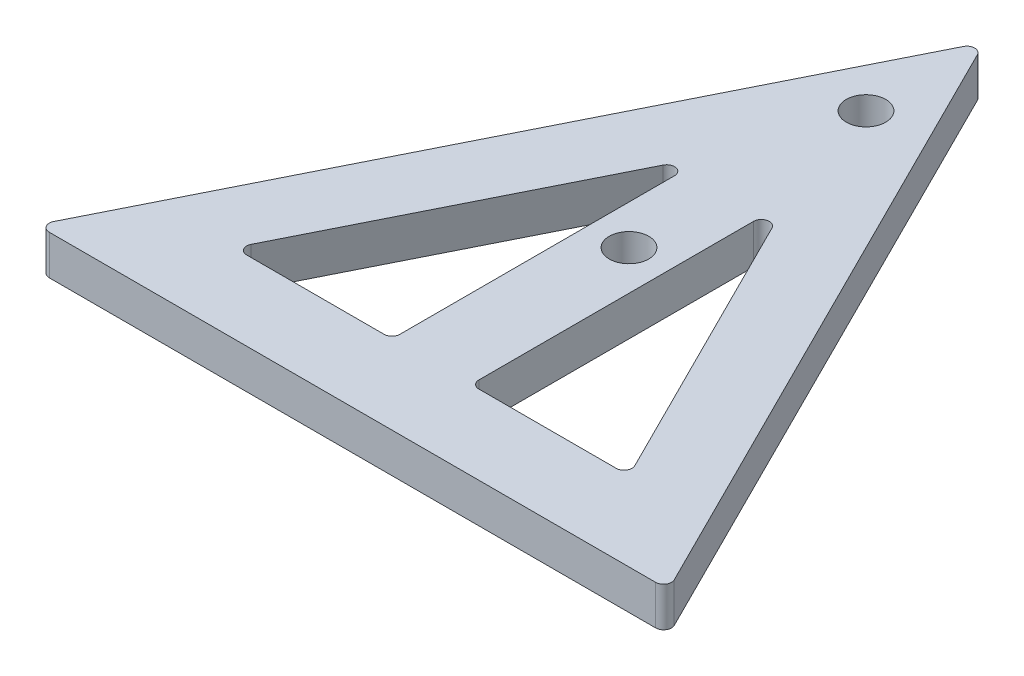
ISO-10303-21;
HEADER;
FILE_DESCRIPTION(('STEP AP214'),'2;1');
FILE_NAME('part.step','',(''),(''),'','','');
FILE_SCHEMA(('AUTOMOTIVE_DESIGN { 1 0 10303 214 1 1 1 1 }'));
ENDSEC;
DATA;
#1=APPLICATION_CONTEXT('core data for automotive mechanical design processes');
#2=APPLICATION_PROTOCOL_DEFINITION('international standard','automotive_design',2000,#1);
#3=PRODUCT_CONTEXT('',#1,'mechanical');
#4=PRODUCT('Part','Part','',(#3));
#5=PRODUCT_RELATED_PRODUCT_CATEGORY('part','',(#4));
#6=PRODUCT_DEFINITION_FORMATION('','',#4);
#7=PRODUCT_DEFINITION_CONTEXT('part definition',#1,'design');
#8=PRODUCT_DEFINITION('design','',#6,#7);
#9=PRODUCT_DEFINITION_SHAPE('','',#8);
#10=(LENGTH_UNIT() NAMED_UNIT(*) SI_UNIT(.MILLI.,.METRE.));
#11=(NAMED_UNIT(*) PLANE_ANGLE_UNIT() SI_UNIT($,.RADIAN.));
#12=(NAMED_UNIT(*) SI_UNIT($,.STERADIAN.) SOLID_ANGLE_UNIT());
#13=UNCERTAINTY_MEASURE_WITH_UNIT(LENGTH_MEASURE(1.E-05),#10,'distance_accuracy_value','');
#14=(GEOMETRIC_REPRESENTATION_CONTEXT(3) GLOBAL_UNCERTAINTY_ASSIGNED_CONTEXT((#13)) GLOBAL_UNIT_ASSIGNED_CONTEXT((#10,
#11,#12)) REPRESENTATION_CONTEXT('',''));
#15=CARTESIAN_POINT('',(0.,0.,0.));
#16=DIRECTION('',(0.,0.,1.));
#17=DIRECTION('',(1.,0.,0.));
#18=AXIS2_PLACEMENT_3D('',#15,#16,#17);
#19=CARTESIAN_POINT('',(0.,12.7,0.));
#20=DIRECTION('',(0.89442539322645,0.,0.447217191028823));
#21=DIRECTION('',(0.447217191028823,0.,-0.89442539322645));
#22=AXIS2_PLACEMENT_3D('',#19,#20,#21);
#23=PLANE('',#22);
#24=DIRECTION('',(-0.447217191028823,0.,0.89442539322645));
#25=VECTOR('',#24,1.);
#26=CARTESIAN_POINT('',(0.,0.,0.));
#27=LINE('',#26,#25);
#28=CARTESIAN_POINT('',(99.3281595012048,0.,-198.654322558452));
#29=VERTEX_POINT('',#28);
#30=CARTESIAN_POINT('',(1.8379843038673,0.,-3.67593166521321));
#31=VERTEX_POINT('',#30);
#32=EDGE_CURVE('E197',#29,#31,#27,.T.);
#33=ORIENTED_EDGE('',*,*,#32,.T.);
#34=DIRECTION('',(0.,-1.,0.));
#35=VECTOR('',#34,1.);
#36=CARTESIAN_POINT('',(1.8379843038673,12.7,-3.67593166521321));
#37=LINE('',#36,#35);
#38=CARTESIAN_POINT('',(1.8379843038673,12.7,-3.67593166521321));
#39=VERTEX_POINT('',#38);
#40=EDGE_CURVE('E175',#31,#39,#37,.F.);
#41=ORIENTED_EDGE('',*,*,#40,.T.);
#42=DIRECTION('',(-0.447217191028823,0.,0.89442539322645));
#43=VECTOR('',#42,1.);
#44=CARTESIAN_POINT('',(0.,12.7,0.));
#45=LINE('',#44,#43);
#46=CARTESIAN_POINT('',(99.3281595012048,12.7,-198.654322558452));
#47=VERTEX_POINT('',#46);
#48=EDGE_CURVE('E200',#47,#39,#45,.T.);
#49=ORIENTED_EDGE('',*,*,#48,.F.);
#50=DIRECTION('',(0.,-1.,0.));
#51=VECTOR('',#50,1.);
#52=CARTESIAN_POINT('',(99.3281595012048,12.7,-198.654322558452));
#53=LINE('',#52,#51);
#54=EDGE_CURVE('E180',#47,#29,#53,.T.);
#55=ORIENTED_EDGE('',*,*,#54,.T.);
#56=EDGE_LOOP('',(#33,#41,#49,#55));
#57=FACE_BOUND('',#56,.T.);
#58=ADVANCED_FACE('F44',(#57),#23,.F.);
#59=CARTESIAN_POINT('',(0.,12.7,0.));
#60=DIRECTION('',(0.,0.,-1.));
#61=DIRECTION('',(-1.,0.,0.));
#62=AXIS2_PLACEMENT_3D('',#59,#60,#61);
#63=PLANE('',#62);
#64=DIRECTION('',(1.,0.,0.));
#65=VECTOR('',#64,1.);
#66=CARTESIAN_POINT('',(0.,12.7,0.));
#67=LINE('',#66,#65);
#68=CARTESIAN_POINT('',(4.10982480266249,12.7,0.));
#69=VERTEX_POINT('',#68);
#70=CARTESIAN_POINT('',(199.090175197338,12.7,0.));
#71=VERTEX_POINT('',#70);
#72=EDGE_CURVE('E190',#69,#71,#67,.T.);
#73=ORIENTED_EDGE('',*,*,#72,.F.);
#74=DIRECTION('',(0.,-1.,0.));
#75=VECTOR('',#74,1.);
#76=CARTESIAN_POINT('',(4.10982480266249,12.7,0.));
#77=LINE('',#76,#75);
#78=CARTESIAN_POINT('',(4.10982480266249,0.,0.));
#79=VERTEX_POINT('',#78);
#80=EDGE_CURVE('E174',#69,#79,#77,.T.);
#81=ORIENTED_EDGE('',*,*,#80,.T.);
#82=DIRECTION('',(1.,0.,0.));
#83=VECTOR('',#82,1.);
#84=CARTESIAN_POINT('',(0.,0.,0.));
#85=LINE('',#84,#83);
#86=CARTESIAN_POINT('',(199.090175197338,0.,0.));
#87=VERTEX_POINT('',#86);
#88=EDGE_CURVE('E187',#79,#87,#85,.T.);
#89=ORIENTED_EDGE('',*,*,#88,.T.);
#90=DIRECTION('',(0.,-1.,0.));
#91=VECTOR('',#90,1.);
#92=CARTESIAN_POINT('',(199.090175197338,12.7,0.));
#93=LINE('',#92,#91);
#94=EDGE_CURVE('E192',#87,#71,#93,.F.);
#95=ORIENTED_EDGE('',*,*,#94,.T.);
#96=EDGE_LOOP('',(#73,#81,#89,#95));
#97=FACE_BOUND('',#96,.T.);
#98=ADVANCED_FACE('F186',(#97),#63,.F.);
#99=CARTESIAN_POINT('',(101.6,12.7,-203.197957893239));
#100=DIRECTION('',(-0.89442539322645,0.,0.447217191028823));
#101=DIRECTION('',(0.447217191028823,0.,0.89442539322645));
#102=AXIS2_PLACEMENT_3D('',#99,#100,#101);
#103=PLANE('',#102);
#104=DIRECTION('',(-0.447217191028823,0.,-0.89442539322645));
#105=VECTOR('',#104,1.);
#106=CARTESIAN_POINT('',(101.6,12.7,-203.197957893239));
#107=LINE('',#106,#105);
#108=CARTESIAN_POINT('',(201.362015696133,12.7,-3.67593166521318));
#109=VERTEX_POINT('',#108);
#110=CARTESIAN_POINT('',(103.871840498795,12.7,-198.654322558452));
#111=VERTEX_POINT('',#110);
#112=EDGE_CURVE('E206',#109,#111,#107,.T.);
#113=ORIENTED_EDGE('',*,*,#112,.F.);
#114=DIRECTION('',(0.,-1.,0.));
#115=VECTOR('',#114,1.);
#116=CARTESIAN_POINT('',(201.362015696133,12.7,-3.67593166521321));
#117=LINE('',#116,#115);
#118=CARTESIAN_POINT('',(201.362015696133,0.,-3.67593166521318));
#119=VERTEX_POINT('',#118);
#120=EDGE_CURVE('E221',#109,#119,#117,.T.);
#121=ORIENTED_EDGE('',*,*,#120,.T.);
#122=DIRECTION('',(-0.447217191028823,0.,-0.89442539322645));
#123=VECTOR('',#122,1.);
#124=CARTESIAN_POINT('',(101.6,0.,-203.197957893239));
#125=LINE('',#124,#123);
#126=CARTESIAN_POINT('',(103.871840498795,0.,-198.654322558452));
#127=VERTEX_POINT('',#126);
#128=EDGE_CURVE('E196',#119,#127,#125,.T.);
#129=ORIENTED_EDGE('',*,*,#128,.T.);
#130=DIRECTION('',(0.,-1.,0.));
#131=VECTOR('',#130,1.);
#132=CARTESIAN_POINT('',(103.871840498795,12.7,-198.654322558452));
#133=LINE('',#132,#131);
#134=EDGE_CURVE('E219',#127,#111,#133,.F.);
#135=ORIENTED_EDGE('',*,*,#134,.T.);
#136=EDGE_LOOP('',(#113,#121,#129,#135));
#137=FACE_BOUND('',#136,.T.);
#138=ADVANCED_FACE('F343',(#137),#103,.F.);
#139=CARTESIAN_POINT('',(0.,12.7,0.));
#140=DIRECTION('',(0.,-1.,0.));
#141=DIRECTION('',(0.,0.,-1.));
#142=AXIS2_PLACEMENT_3D('',#139,#140,#141);
#143=PLANE('',#142);
#144=CARTESIAN_POINT('',(101.6,12.7,-88.9));
#145=DIRECTION('',(0.,1.,0.));
#146=DIRECTION('',(0.,0.,1.));
#147=AXIS2_PLACEMENT_3D('',#144,#145,#146);
#148=CIRCLE('',#147,6.34999999999999);
#149=CARTESIAN_POINT('',(101.6,12.7,-82.55));
#150=VERTEX_POINT('',#149);
#151=EDGE_CURVE('E406',#150,#150,#148,.T.);
#152=ORIENTED_EDGE('',*,*,#151,.F.);
#153=EDGE_LOOP('',(#152));
#154=FACE_BOUND('',#153,.T.);
#155=DIRECTION('',(1.,0.,0.));
#156=VECTOR('',#155,1.);
#157=CARTESIAN_POINT('',(38.1,12.7,-25.4));
#158=LINE('',#157,#156);
#159=CARTESIAN_POINT('',(42.2098063314247,12.7,-25.4));
#160=VERTEX_POINT('',#159);
#161=CARTESIAN_POINT('',(86.36,12.7,-25.4));
#162=VERTEX_POINT('',#161);
#163=EDGE_CURVE('E291',#160,#162,#158,.T.);
#164=ORIENTED_EDGE('',*,*,#163,.F.);
#165=CARTESIAN_POINT('',(42.2098063314247,12.7,-27.94));
#166=DIRECTION('',(0.,-1.,0.));
#167=DIRECTION('',(0.,0.,-1.));
#168=AXIS2_PLACEMENT_3D('',#165,#166,#167);
#169=CIRCLE('',#168,2.54);
#170=CARTESIAN_POINT('',(39.937961266285,12.7,-29.0759225325699));
#171=VERTEX_POINT('',#170);
#172=EDGE_CURVE('E13',#160,#171,#169,.T.);
#173=ORIENTED_EDGE('',*,*,#172,.T.);
#174=DIRECTION('',(0.447213595499958,0.,-0.894427190999916));
#175=VECTOR('',#174,1.);
#176=CARTESIAN_POINT('',(38.1,12.7,-25.4));
#177=LINE('',#176,#175);
#178=CARTESIAN_POINT('',(84.0881549348602,12.7,-117.37630986972));
#179=VERTEX_POINT('',#178);
#180=EDGE_CURVE('E202',#171,#179,#177,.T.);
#181=ORIENTED_EDGE('',*,*,#180,.T.);
#182=CARTESIAN_POINT('',(86.36,12.7,-116.240387337151));
#183=DIRECTION('',(0.,-1.,0.));
#184=DIRECTION('',(0.,0.,-1.));
#185=AXIS2_PLACEMENT_3D('',#182,#183,#184);
#186=CIRCLE('',#185,2.54);
#187=CARTESIAN_POINT('',(88.9,12.7,-116.240387337151));
#188=VERTEX_POINT('',#187);
#189=EDGE_CURVE('E267',#179,#188,#186,.T.);
#190=ORIENTED_EDGE('',*,*,#189,.T.);
#191=DIRECTION('',(0.,0.,-1.));
#192=VECTOR('',#191,1.);
#193=CARTESIAN_POINT('',(88.9,12.7,-25.4));
#194=LINE('',#193,#192);
#195=CARTESIAN_POINT('',(88.9,12.7,-27.94));
#196=VERTEX_POINT('',#195);
#197=EDGE_CURVE('E295',#196,#188,#194,.T.);
#198=ORIENTED_EDGE('',*,*,#197,.F.);
#199=CARTESIAN_POINT('',(86.36,12.7,-27.94));
#200=DIRECTION('',(0.,-1.,0.));
#201=DIRECTION('',(0.,0.,-1.));
#202=AXIS2_PLACEMENT_3D('',#199,#200,#201);
#203=CIRCLE('',#202,2.54);
#204=EDGE_CURVE('E59',#196,#162,#203,.T.);
#205=ORIENTED_EDGE('',*,*,#204,.T.);
#206=EDGE_LOOP('',(#164,#173,#181,#190,#198,#205));
#207=FACE_BOUND('',#206,.T.);
#208=DIRECTION('',(-0.447213595499958,0.,-0.894427190999916));
#209=VECTOR('',#208,1.);
#210=CARTESIAN_POINT('',(165.1,12.7,-25.4000000000001));
#211=LINE('',#210,#209);
#212=CARTESIAN_POINT('',(163.262038733715,12.7,-29.07592253257));
#213=VERTEX_POINT('',#212);
#214=CARTESIAN_POINT('',(119.11184506514,12.7,-117.37630986972));
#215=VERTEX_POINT('',#214);
#216=EDGE_CURVE('E308',#213,#215,#211,.T.);
#217=ORIENTED_EDGE('',*,*,#216,.F.);
#218=CARTESIAN_POINT('',(160.990193668575,12.7,-27.9400000000001));
#219=DIRECTION('',(0.,-1.,0.));
#220=DIRECTION('',(0.,0.,-1.));
#221=AXIS2_PLACEMENT_3D('',#218,#219,#220);
#222=CIRCLE('',#221,2.54);
#223=CARTESIAN_POINT('',(160.990193668575,12.7,-25.4000000000001));
#224=VERTEX_POINT('',#223);
#225=EDGE_CURVE('E255',#213,#224,#222,.T.);
#226=ORIENTED_EDGE('',*,*,#225,.T.);
#227=DIRECTION('',(-1.,0.,0.));
#228=VECTOR('',#227,1.);
#229=CARTESIAN_POINT('',(165.1,12.7,-25.4000000000001));
#230=LINE('',#229,#228);
#231=CARTESIAN_POINT('',(116.84,12.7,-25.4000000000001));
#232=VERTEX_POINT('',#231);
#233=EDGE_CURVE('E313',#224,#232,#230,.T.);
#234=ORIENTED_EDGE('',*,*,#233,.T.);
#235=CARTESIAN_POINT('',(116.84,12.7,-27.9400000000001));
#236=DIRECTION('',(0.,-1.,0.));
#237=DIRECTION('',(0.,0.,-1.));
#238=AXIS2_PLACEMENT_3D('',#235,#236,#237);
#239=CIRCLE('',#238,2.54);
#240=CARTESIAN_POINT('',(114.3,12.7,-27.9400000000001));
#241=VERTEX_POINT('',#240);
#242=EDGE_CURVE('E259',#232,#241,#239,.T.);
#243=ORIENTED_EDGE('',*,*,#242,.T.);
#244=DIRECTION('',(0.,0.,-1.));
#245=VECTOR('',#244,1.);
#246=CARTESIAN_POINT('',(114.3,12.7,-25.4000000000001));
#247=LINE('',#246,#245);
#248=CARTESIAN_POINT('',(114.3,12.7,-116.240387337151));
#249=VERTEX_POINT('',#248);
#250=EDGE_CURVE('E316',#241,#249,#247,.T.);
#251=ORIENTED_EDGE('',*,*,#250,.T.);
#252=CARTESIAN_POINT('',(116.84,12.7,-116.240387337151));
#253=DIRECTION('',(0.,-1.,0.));
#254=DIRECTION('',(0.,0.,-1.));
#255=AXIS2_PLACEMENT_3D('',#252,#253,#254);
#256=CIRCLE('',#255,2.54);
#257=EDGE_CURVE('E263',#249,#215,#256,.T.);
#258=ORIENTED_EDGE('',*,*,#257,.T.);
#259=EDGE_LOOP('',(#217,#226,#234,#243,#251,#258));
#260=FACE_BOUND('',#259,.T.);
#261=CARTESIAN_POINT('',(101.6,12.7,-165.097957893239));
#262=DIRECTION('',(0.,1.,0.));
#263=DIRECTION('',(0.,0.,1.));
#264=AXIS2_PLACEMENT_3D('',#261,#262,#263);
#265=CIRCLE('',#264,6.34999999999999);
#266=CARTESIAN_POINT('',(101.6,12.7,-158.747957893239));
#267=VERTEX_POINT('',#266);
#268=EDGE_CURVE('E324',#267,#267,#265,.T.);
#269=ORIENTED_EDGE('',*,*,#268,.F.);
#270=EDGE_LOOP('',(#269));
#271=FACE_BOUND('',#270,.T.);
#272=ORIENTED_EDGE('',*,*,#48,.T.);
#273=CARTESIAN_POINT('',(4.10982480266249,12.7,-2.54));
#274=DIRECTION('',(0.,-1.,0.));
#275=DIRECTION('',(0.,0.,-1.));
#276=AXIS2_PLACEMENT_3D('',#273,#274,#275);
#277=CIRCLE('',#276,2.54);
#278=EDGE_CURVE('E217',#39,#69,#277,.F.);
#279=ORIENTED_EDGE('',*,*,#278,.T.);
#280=ORIENTED_EDGE('',*,*,#72,.T.);
#281=CARTESIAN_POINT('',(199.090175197338,12.7,-2.53999999999999));
#282=DIRECTION('',(0.,-1.,0.));
#283=DIRECTION('',(0.,0.,-1.));
#284=AXIS2_PLACEMENT_3D('',#281,#282,#283);
#285=CIRCLE('',#284,2.54);
#286=EDGE_CURVE('E215',#71,#109,#285,.F.);
#287=ORIENTED_EDGE('',*,*,#286,.T.);
#288=ORIENTED_EDGE('',*,*,#112,.T.);
#289=CARTESIAN_POINT('',(101.6,12.7,-197.518390893239));
#290=DIRECTION('',(0.,-1.,0.));
#291=DIRECTION('',(0.,0.,-1.));
#292=AXIS2_PLACEMENT_3D('',#289,#290,#291);
#293=CIRCLE('',#292,2.54);
#294=EDGE_CURVE('E213',#111,#47,#293,.F.);
#295=ORIENTED_EDGE('',*,*,#294,.T.);
#296=EDGE_LOOP('',(#272,#279,#280,#287,#288,#295));
#297=FACE_BOUND('',#296,.T.);
#298=ADVANCED_FACE('F288',(#154,#207,#260,#271,#297),#143,.F.);
#299=CARTESIAN_POINT('',(0.,0.,0.));
#300=DIRECTION('',(0.,-1.,0.));
#301=DIRECTION('',(0.,0.,-1.));
#302=AXIS2_PLACEMENT_3D('',#299,#300,#301);
#303=PLANE('',#302);
#304=CARTESIAN_POINT('',(101.6,0.,-88.9));
#305=DIRECTION('',(0.,1.,0.));
#306=DIRECTION('',(0.,0.,1.));
#307=AXIS2_PLACEMENT_3D('',#304,#305,#306);
#308=CIRCLE('',#307,6.34999999999999);
#309=CARTESIAN_POINT('',(101.6,0.,-82.55));
#310=VERTEX_POINT('',#309);
#311=EDGE_CURVE('E327',#310,#310,#308,.T.);
#312=ORIENTED_EDGE('',*,*,#311,.T.);
#313=EDGE_LOOP('',(#312));
#314=FACE_BOUND('',#313,.T.);
#315=DIRECTION('',(0.447213595499958,0.,-0.894427190999916));
#316=VECTOR('',#315,1.);
#317=CARTESIAN_POINT('',(38.1,0.,-25.4));
#318=LINE('',#317,#316);
#319=CARTESIAN_POINT('',(39.937961266285,0.,-29.0759225325699));
#320=VERTEX_POINT('',#319);
#321=CARTESIAN_POINT('',(84.0881549348602,0.,-117.37630986972));
#322=VERTEX_POINT('',#321);
#323=EDGE_CURVE('E277',#320,#322,#318,.T.);
#324=ORIENTED_EDGE('',*,*,#323,.F.);
#325=CARTESIAN_POINT('',(42.2098063314247,0.,-27.94));
#326=DIRECTION('',(0.,-1.,0.));
#327=DIRECTION('',(0.,0.,-1.));
#328=AXIS2_PLACEMENT_3D('',#325,#326,#327);
#329=CIRCLE('',#328,2.54);
#330=CARTESIAN_POINT('',(42.2098063314247,0.,-25.4));
#331=VERTEX_POINT('',#330);
#332=EDGE_CURVE('E52',#320,#331,#329,.F.);
#333=ORIENTED_EDGE('',*,*,#332,.T.);
#334=DIRECTION('',(1.,0.,0.));
#335=VECTOR('',#334,1.);
#336=CARTESIAN_POINT('',(38.1,0.,-25.4));
#337=LINE('',#336,#335);
#338=CARTESIAN_POINT('',(86.36,0.,-25.4));
#339=VERTEX_POINT('',#338);
#340=EDGE_CURVE('E275',#331,#339,#337,.T.);
#341=ORIENTED_EDGE('',*,*,#340,.T.);
#342=CARTESIAN_POINT('',(86.36,0.,-27.94));
#343=DIRECTION('',(0.,-1.,0.));
#344=DIRECTION('',(0.,0.,-1.));
#345=AXIS2_PLACEMENT_3D('',#342,#343,#344);
#346=CIRCLE('',#345,2.54);
#347=CARTESIAN_POINT('',(88.9,0.,-27.94));
#348=VERTEX_POINT('',#347);
#349=EDGE_CURVE('E269',#339,#348,#346,.F.);
#350=ORIENTED_EDGE('',*,*,#349,.T.);
#351=DIRECTION('',(0.,0.,-1.));
#352=VECTOR('',#351,1.);
#353=CARTESIAN_POINT('',(88.9,0.,-25.4));
#354=LINE('',#353,#352);
#355=CARTESIAN_POINT('',(88.9,0.,-116.240387337151));
#356=VERTEX_POINT('',#355);
#357=EDGE_CURVE('E282',#348,#356,#354,.T.);
#358=ORIENTED_EDGE('',*,*,#357,.T.);
#359=CARTESIAN_POINT('',(86.36,0.,-116.240387337151));
#360=DIRECTION('',(0.,-1.,0.));
#361=DIRECTION('',(0.,0.,-1.));
#362=AXIS2_PLACEMENT_3D('',#359,#360,#361);
#363=CIRCLE('',#362,2.54);
#364=EDGE_CURVE('E265',#356,#322,#363,.F.);
#365=ORIENTED_EDGE('',*,*,#364,.T.);
#366=EDGE_LOOP('',(#324,#333,#341,#350,#358,#365));
#367=FACE_BOUND('',#366,.T.);
#368=DIRECTION('',(-1.,0.,0.));
#369=VECTOR('',#368,1.);
#370=CARTESIAN_POINT('',(165.1,0.,-25.4000000000001));
#371=LINE('',#370,#369);
#372=CARTESIAN_POINT('',(160.990193668575,0.,-25.4000000000001));
#373=VERTEX_POINT('',#372);
#374=CARTESIAN_POINT('',(116.84,0.,-25.4000000000001));
#375=VERTEX_POINT('',#374);
#376=EDGE_CURVE('E304',#373,#375,#371,.T.);
#377=ORIENTED_EDGE('',*,*,#376,.F.);
#378=CARTESIAN_POINT('',(160.990193668575,0.,-27.9400000000001));
#379=DIRECTION('',(0.,-1.,0.));
#380=DIRECTION('',(0.,0.,-1.));
#381=AXIS2_PLACEMENT_3D('',#378,#379,#380);
#382=CIRCLE('',#381,2.54);
#383=CARTESIAN_POINT('',(163.262038733715,0.,-29.07592253257));
#384=VERTEX_POINT('',#383);
#385=EDGE_CURVE('E253',#373,#384,#382,.F.);
#386=ORIENTED_EDGE('',*,*,#385,.T.);
#387=DIRECTION('',(-0.447213595499958,0.,-0.894427190999916));
#388=VECTOR('',#387,1.);
#389=CARTESIAN_POINT('',(165.1,0.,-25.4000000000001));
#390=LINE('',#389,#388);
#391=CARTESIAN_POINT('',(119.11184506514,0.,-117.37630986972));
#392=VERTEX_POINT('',#391);
#393=EDGE_CURVE('E283',#384,#392,#390,.T.);
#394=ORIENTED_EDGE('',*,*,#393,.T.);
#395=CARTESIAN_POINT('',(116.84,0.,-116.240387337151));
#396=DIRECTION('',(0.,-1.,0.));
#397=DIRECTION('',(0.,0.,-1.));
#398=AXIS2_PLACEMENT_3D('',#395,#396,#397);
#399=CIRCLE('',#398,2.54);
#400=CARTESIAN_POINT('',(114.3,0.,-116.240387337151));
#401=VERTEX_POINT('',#400);
#402=EDGE_CURVE('E261',#392,#401,#399,.F.);
#403=ORIENTED_EDGE('',*,*,#402,.T.);
#404=DIRECTION('',(0.,0.,-1.));
#405=VECTOR('',#404,1.);
#406=CARTESIAN_POINT('',(114.3,0.,-25.4000000000001));
#407=LINE('',#406,#405);
#408=CARTESIAN_POINT('',(114.3,0.,-27.9400000000001));
#409=VERTEX_POINT('',#408);
#410=EDGE_CURVE('E307',#409,#401,#407,.T.);
#411=ORIENTED_EDGE('',*,*,#410,.F.);
#412=CARTESIAN_POINT('',(116.84,0.,-27.9400000000001));
#413=DIRECTION('',(0.,-1.,0.));
#414=DIRECTION('',(0.,0.,-1.));
#415=AXIS2_PLACEMENT_3D('',#412,#413,#414);
#416=CIRCLE('',#415,2.54);
#417=EDGE_CURVE('E257',#409,#375,#416,.F.);
#418=ORIENTED_EDGE('',*,*,#417,.T.);
#419=EDGE_LOOP('',(#377,#386,#394,#403,#411,#418));
#420=FACE_BOUND('',#419,.T.);
#421=CARTESIAN_POINT('',(101.6,0.,-165.097957893239));
#422=DIRECTION('',(0.,1.,0.));
#423=DIRECTION('',(0.,0.,1.));
#424=AXIS2_PLACEMENT_3D('',#421,#422,#423);
#425=CIRCLE('',#424,6.34999999999999);
#426=CARTESIAN_POINT('',(101.6,0.,-158.747957893239));
#427=VERTEX_POINT('',#426);
#428=EDGE_CURVE('E317',#427,#427,#425,.T.);
#429=ORIENTED_EDGE('',*,*,#428,.T.);
#430=EDGE_LOOP('',(#429));
#431=FACE_BOUND('',#430,.T.);
#432=ORIENTED_EDGE('',*,*,#88,.F.);
#433=CARTESIAN_POINT('',(4.10982480266249,0.,-2.54));
#434=DIRECTION('',(0.,-1.,0.));
#435=DIRECTION('',(0.,0.,-1.));
#436=AXIS2_PLACEMENT_3D('',#433,#434,#435);
#437=CIRCLE('',#436,2.54);
#438=EDGE_CURVE('E170',#79,#31,#437,.T.);
#439=ORIENTED_EDGE('',*,*,#438,.T.);
#440=ORIENTED_EDGE('',*,*,#32,.F.);
#441=CARTESIAN_POINT('',(101.6,0.,-197.518390893239));
#442=DIRECTION('',(0.,-1.,0.));
#443=DIRECTION('',(0.,0.,-1.));
#444=AXIS2_PLACEMENT_3D('',#441,#442,#443);
#445=CIRCLE('',#444,2.54);
#446=EDGE_CURVE('E191',#29,#127,#445,.T.);
#447=ORIENTED_EDGE('',*,*,#446,.T.);
#448=ORIENTED_EDGE('',*,*,#128,.F.);
#449=CARTESIAN_POINT('',(199.090175197338,0.,-2.53999999999999));
#450=DIRECTION('',(0.,-1.,0.));
#451=DIRECTION('',(0.,0.,-1.));
#452=AXIS2_PLACEMENT_3D('',#449,#450,#451);
#453=CIRCLE('',#452,2.54);
#454=EDGE_CURVE('E181',#119,#87,#453,.T.);
#455=ORIENTED_EDGE('',*,*,#454,.T.);
#456=EDGE_LOOP('',(#432,#439,#440,#447,#448,#455));
#457=FACE_BOUND('',#456,.T.);
#458=ADVANCED_FACE('F194',(#314,#367,#420,#431,#457),#303,.T.);
#459=CARTESIAN_POINT('',(101.6,12.7,-165.097957893239));
#460=DIRECTION('',(0.,-1.,0.));
#461=DIRECTION('',(0.,0.,-1.));
#462=AXIS2_PLACEMENT_3D('',#459,#460,#461);
#463=CYLINDRICAL_SURFACE('',#462,6.34999999999999);
#464=ORIENTED_EDGE('',*,*,#268,.T.);
#465=EDGE_LOOP('',(#464));
#466=FACE_BOUND('',#465,.T.);
#467=ORIENTED_EDGE('',*,*,#428,.F.);
#468=EDGE_LOOP('',(#467));
#469=FACE_BOUND('',#468,.T.);
#470=ADVANCED_FACE('F366',(#466,#469),#463,.F.);
#471=CARTESIAN_POINT('',(165.1,12.7,-25.4000000000001));
#472=DIRECTION('',(-0.894427190999916,0.,0.447213595499958));
#473=DIRECTION('',(0.447213595499958,0.,0.894427190999916));
#474=AXIS2_PLACEMENT_3D('',#471,#472,#473);
#475=PLANE('',#474);
#476=ORIENTED_EDGE('',*,*,#393,.F.);
#477=DIRECTION('',(0.,-1.,0.));
#478=VECTOR('',#477,1.);
#479=CARTESIAN_POINT('',(163.262038733715,12.7,-29.07592253257));
#480=LINE('',#479,#478);
#481=EDGE_CURVE('E232',#384,#213,#480,.F.);
#482=ORIENTED_EDGE('',*,*,#481,.T.);
#483=ORIENTED_EDGE('',*,*,#216,.T.);
#484=DIRECTION('',(0.,-1.,0.));
#485=VECTOR('',#484,1.);
#486=CARTESIAN_POINT('',(119.11184506514,12.7,-117.376309869721));
#487=LINE('',#486,#485);
#488=EDGE_CURVE('E229',#215,#392,#487,.T.);
#489=ORIENTED_EDGE('',*,*,#488,.T.);
#490=EDGE_LOOP('',(#476,#482,#483,#489));
#491=FACE_BOUND('',#490,.T.);
#492=ADVANCED_FACE('F373',(#491),#475,.T.);
#493=CARTESIAN_POINT('',(114.3,12.7,-25.4000000000001));
#494=DIRECTION('',(-1.,0.,0.));
#495=DIRECTION('',(0.,0.,1.));
#496=AXIS2_PLACEMENT_3D('',#493,#494,#495);
#497=PLANE('',#496);
#498=ORIENTED_EDGE('',*,*,#250,.F.);
#499=DIRECTION('',(0.,-1.,0.));
#500=VECTOR('',#499,1.);
#501=CARTESIAN_POINT('',(114.3,0.,-27.9400000000001));
#502=LINE('',#501,#500);
#503=EDGE_CURVE('E236',#241,#409,#502,.T.);
#504=ORIENTED_EDGE('',*,*,#503,.T.);
#505=ORIENTED_EDGE('',*,*,#410,.T.);
#506=DIRECTION('',(0.,-1.,0.));
#507=VECTOR('',#506,1.);
#508=CARTESIAN_POINT('',(114.3,12.7,-116.240387337151));
#509=LINE('',#508,#507);
#510=EDGE_CURVE('E234',#401,#249,#509,.F.);
#511=ORIENTED_EDGE('',*,*,#510,.T.);
#512=EDGE_LOOP('',(#498,#504,#505,#511));
#513=FACE_BOUND('',#512,.T.);
#514=ADVANCED_FACE('F378',(#513),#497,.F.);
#515=CARTESIAN_POINT('',(165.1,12.7,-25.4000000000001));
#516=DIRECTION('',(0.,0.,1.));
#517=DIRECTION('',(1.,0.,0.));
#518=AXIS2_PLACEMENT_3D('',#515,#516,#517);
#519=PLANE('',#518);
#520=ORIENTED_EDGE('',*,*,#233,.F.);
#521=DIRECTION('',(0.,-1.,0.));
#522=VECTOR('',#521,1.);
#523=CARTESIAN_POINT('',(160.990193668575,12.7,-25.4000000000001));
#524=LINE('',#523,#522);
#525=EDGE_CURVE('E226',#224,#373,#524,.T.);
#526=ORIENTED_EDGE('',*,*,#525,.T.);
#527=ORIENTED_EDGE('',*,*,#376,.T.);
#528=DIRECTION('',(0.,-1.,0.));
#529=VECTOR('',#528,1.);
#530=CARTESIAN_POINT('',(116.84,12.7,-25.4000000000001));
#531=LINE('',#530,#529);
#532=EDGE_CURVE('E224',#375,#232,#531,.F.);
#533=ORIENTED_EDGE('',*,*,#532,.T.);
#534=EDGE_LOOP('',(#520,#526,#527,#533));
#535=FACE_BOUND('',#534,.T.);
#536=ADVANCED_FACE('F375',(#535),#519,.F.);
#537=CARTESIAN_POINT('',(38.1,12.7,-25.4));
#538=DIRECTION('',(0.,0.,-1.));
#539=DIRECTION('',(-1.,0.,0.));
#540=AXIS2_PLACEMENT_3D('',#537,#538,#539);
#541=PLANE('',#540);
#542=ORIENTED_EDGE('',*,*,#163,.T.);
#543=DIRECTION('',(0.,-1.,0.));
#544=VECTOR('',#543,1.);
#545=CARTESIAN_POINT('',(86.36,0.,-25.4));
#546=LINE('',#545,#544);
#547=EDGE_CURVE('E250',#162,#339,#546,.T.);
#548=ORIENTED_EDGE('',*,*,#547,.T.);
#549=ORIENTED_EDGE('',*,*,#340,.F.);
#550=DIRECTION('',(0.,-1.,0.));
#551=VECTOR('',#550,1.);
#552=CARTESIAN_POINT('',(42.2098063314247,12.7,-25.4));
#553=LINE('',#552,#551);
#554=EDGE_CURVE('E66',#331,#160,#553,.F.);
#555=ORIENTED_EDGE('',*,*,#554,.T.);
#556=EDGE_LOOP('',(#542,#548,#549,#555));
#557=FACE_BOUND('',#556,.T.);
#558=ADVANCED_FACE('F280',(#557),#541,.T.);
#559=CARTESIAN_POINT('',(88.9,12.7,-25.4));
#560=DIRECTION('',(-1.,0.,0.));
#561=DIRECTION('',(0.,0.,1.));
#562=AXIS2_PLACEMENT_3D('',#559,#560,#561);
#563=PLANE('',#562);
#564=ORIENTED_EDGE('',*,*,#197,.T.);
#565=DIRECTION('',(0.,-1.,0.));
#566=VECTOR('',#565,1.);
#567=CARTESIAN_POINT('',(88.9,12.7,-116.240387337151));
#568=LINE('',#567,#566);
#569=EDGE_CURVE('E241',#188,#356,#568,.T.);
#570=ORIENTED_EDGE('',*,*,#569,.T.);
#571=ORIENTED_EDGE('',*,*,#357,.F.);
#572=DIRECTION('',(0.,-1.,0.));
#573=VECTOR('',#572,1.);
#574=CARTESIAN_POINT('',(88.9,12.7,-27.94));
#575=LINE('',#574,#573);
#576=EDGE_CURVE('E239',#348,#196,#575,.F.);
#577=ORIENTED_EDGE('',*,*,#576,.T.);
#578=EDGE_LOOP('',(#564,#570,#571,#577));
#579=FACE_BOUND('',#578,.T.);
#580=ADVANCED_FACE('F388',(#579),#563,.T.);
#581=CARTESIAN_POINT('',(38.1,12.7,-25.4));
#582=DIRECTION('',(-0.894427190999916,0.,-0.447213595499958));
#583=DIRECTION('',(-0.447213595499958,0.,0.894427190999916));
#584=AXIS2_PLACEMENT_3D('',#581,#582,#583);
#585=PLANE('',#584);
#586=ORIENTED_EDGE('',*,*,#323,.T.);
#587=DIRECTION('',(0.,-1.,0.));
#588=VECTOR('',#587,1.);
#589=CARTESIAN_POINT('',(84.0881549348602,12.7,-117.37630986972));
#590=LINE('',#589,#588);
#591=EDGE_CURVE('E247',#322,#179,#590,.F.);
#592=ORIENTED_EDGE('',*,*,#591,.T.);
#593=ORIENTED_EDGE('',*,*,#180,.F.);
#594=DIRECTION('',(0.,-1.,0.));
#595=VECTOR('',#594,1.);
#596=CARTESIAN_POINT('',(39.937961266285,12.7,-29.0759225325699));
#597=LINE('',#596,#595);
#598=EDGE_CURVE('E244',#171,#320,#597,.T.);
#599=ORIENTED_EDGE('',*,*,#598,.T.);
#600=EDGE_LOOP('',(#586,#592,#593,#599));
#601=FACE_BOUND('',#600,.T.);
#602=ADVANCED_FACE('F293',(#601),#585,.F.);
#603=CARTESIAN_POINT('',(4.10982480266249,12.7,-2.54));
#604=DIRECTION('',(0.,-1.,0.));
#605=DIRECTION('',(0.,0.,-1.));
#606=AXIS2_PLACEMENT_3D('',#603,#604,#605);
#607=CYLINDRICAL_SURFACE('',#606,2.54);
#608=ORIENTED_EDGE('',*,*,#278,.F.);
#609=ORIENTED_EDGE('',*,*,#40,.F.);
#610=ORIENTED_EDGE('',*,*,#438,.F.);
#611=ORIENTED_EDGE('',*,*,#80,.F.);
#612=EDGE_LOOP('',(#608,#609,#610,#611));
#613=FACE_BOUND('',#612,.T.);
#614=ADVANCED_FACE('F173',(#613),#607,.T.);
#615=CARTESIAN_POINT('',(199.090175197338,12.7,-2.53999999999999));
#616=DIRECTION('',(0.,-1.,0.));
#617=DIRECTION('',(0.,0.,-1.));
#618=AXIS2_PLACEMENT_3D('',#615,#616,#617);
#619=CYLINDRICAL_SURFACE('',#618,2.54);
#620=ORIENTED_EDGE('',*,*,#286,.F.);
#621=ORIENTED_EDGE('',*,*,#94,.F.);
#622=ORIENTED_EDGE('',*,*,#454,.F.);
#623=ORIENTED_EDGE('',*,*,#120,.F.);
#624=EDGE_LOOP('',(#620,#621,#622,#623));
#625=FACE_BOUND('',#624,.T.);
#626=ADVANCED_FACE('F345',(#625),#619,.T.);
#627=CARTESIAN_POINT('',(101.6,12.7,-197.518390893239));
#628=DIRECTION('',(0.,-1.,0.));
#629=DIRECTION('',(0.,0.,-1.));
#630=AXIS2_PLACEMENT_3D('',#627,#628,#629);
#631=CYLINDRICAL_SURFACE('',#630,2.54);
#632=ORIENTED_EDGE('',*,*,#294,.F.);
#633=ORIENTED_EDGE('',*,*,#134,.F.);
#634=ORIENTED_EDGE('',*,*,#446,.F.);
#635=ORIENTED_EDGE('',*,*,#54,.F.);
#636=EDGE_LOOP('',(#632,#633,#634,#635));
#637=FACE_BOUND('',#636,.T.);
#638=ADVANCED_FACE('F341',(#637),#631,.T.);
#639=CARTESIAN_POINT('',(160.990193668575,12.7,-27.9400000000001));
#640=DIRECTION('',(0.,-1.,0.));
#641=DIRECTION('',(0.,0.,-1.));
#642=AXIS2_PLACEMENT_3D('',#639,#640,#641);
#643=CYLINDRICAL_SURFACE('',#642,2.54);
#644=ORIENTED_EDGE('',*,*,#225,.F.);
#645=ORIENTED_EDGE('',*,*,#481,.F.);
#646=ORIENTED_EDGE('',*,*,#385,.F.);
#647=ORIENTED_EDGE('',*,*,#525,.F.);
#648=EDGE_LOOP('',(#644,#645,#646,#647));
#649=FACE_BOUND('',#648,.T.);
#650=ADVANCED_FACE('F352',(#649),#643,.F.);
#651=CARTESIAN_POINT('',(116.84,12.7,-27.9400000000001));
#652=DIRECTION('',(0.,1.,0.));
#653=DIRECTION('',(0.,0.,1.));
#654=AXIS2_PLACEMENT_3D('',#651,#652,#653);
#655=CYLINDRICAL_SURFACE('',#654,2.54);
#656=ORIENTED_EDGE('',*,*,#242,.F.);
#657=ORIENTED_EDGE('',*,*,#532,.F.);
#658=ORIENTED_EDGE('',*,*,#417,.F.);
#659=ORIENTED_EDGE('',*,*,#503,.F.);
#660=EDGE_LOOP('',(#656,#657,#658,#659));
#661=FACE_BOUND('',#660,.T.);
#662=ADVANCED_FACE('F422',(#661),#655,.F.);
#663=CARTESIAN_POINT('',(116.84,12.7,-116.240387337151));
#664=DIRECTION('',(0.,-1.,0.));
#665=DIRECTION('',(0.,0.,-1.));
#666=AXIS2_PLACEMENT_3D('',#663,#664,#665);
#667=CYLINDRICAL_SURFACE('',#666,2.54);
#668=ORIENTED_EDGE('',*,*,#257,.F.);
#669=ORIENTED_EDGE('',*,*,#510,.F.);
#670=ORIENTED_EDGE('',*,*,#402,.F.);
#671=ORIENTED_EDGE('',*,*,#488,.F.);
#672=EDGE_LOOP('',(#668,#669,#670,#671));
#673=FACE_BOUND('',#672,.T.);
#674=ADVANCED_FACE('F416',(#673),#667,.F.);
#675=CARTESIAN_POINT('',(86.36,12.7,-116.240387337151));
#676=DIRECTION('',(0.,-1.,0.));
#677=DIRECTION('',(0.,0.,-1.));
#678=AXIS2_PLACEMENT_3D('',#675,#676,#677);
#679=CYLINDRICAL_SURFACE('',#678,2.54);
#680=ORIENTED_EDGE('',*,*,#189,.F.);
#681=ORIENTED_EDGE('',*,*,#591,.F.);
#682=ORIENTED_EDGE('',*,*,#364,.F.);
#683=ORIENTED_EDGE('',*,*,#569,.F.);
#684=EDGE_LOOP('',(#680,#681,#682,#683));
#685=FACE_BOUND('',#684,.T.);
#686=ADVANCED_FACE('F414',(#685),#679,.F.);
#687=CARTESIAN_POINT('',(86.36,12.7,-27.94));
#688=DIRECTION('',(0.,1.,0.));
#689=DIRECTION('',(0.,0.,1.));
#690=AXIS2_PLACEMENT_3D('',#687,#688,#689);
#691=CYLINDRICAL_SURFACE('',#690,2.54);
#692=ORIENTED_EDGE('',*,*,#204,.F.);
#693=ORIENTED_EDGE('',*,*,#576,.F.);
#694=ORIENTED_EDGE('',*,*,#349,.F.);
#695=ORIENTED_EDGE('',*,*,#547,.F.);
#696=EDGE_LOOP('',(#692,#693,#694,#695));
#697=FACE_BOUND('',#696,.T.);
#698=ADVANCED_FACE('F400',(#697),#691,.F.);
#699=CARTESIAN_POINT('',(42.2098063314247,12.7,-27.94));
#700=DIRECTION('',(0.,-1.,0.));
#701=DIRECTION('',(0.,0.,-1.));
#702=AXIS2_PLACEMENT_3D('',#699,#700,#701);
#703=CYLINDRICAL_SURFACE('',#702,2.54);
#704=ORIENTED_EDGE('',*,*,#172,.F.);
#705=ORIENTED_EDGE('',*,*,#554,.F.);
#706=ORIENTED_EDGE('',*,*,#332,.F.);
#707=ORIENTED_EDGE('',*,*,#598,.F.);
#708=EDGE_LOOP('',(#704,#705,#706,#707));
#709=FACE_BOUND('',#708,.T.);
#710=ADVANCED_FACE('F46',(#709),#703,.F.);
#711=CARTESIAN_POINT('',(101.6,0.,-88.9));
#712=DIRECTION('',(0.,1.,0.));
#713=DIRECTION('',(0.,0.,1.));
#714=AXIS2_PLACEMENT_3D('',#711,#712,#713);
#715=CYLINDRICAL_SURFACE('',#714,6.34999999999999);
#716=CARTESIAN_POINT('',(101.6,0.,-82.55));
#717=CARTESIAN_POINT('',(101.6,0.132291666666665,-82.55));
#718=CARTESIAN_POINT('',(101.6,0.264583333333332,-82.55));
#719=CARTESIAN_POINT('',(101.6,0.529166666666665,-82.55));
#720=CARTESIAN_POINT('',(101.6,0.661458333333332,-82.55));
#721=CARTESIAN_POINT('',(101.6,0.926041666666665,-82.55));
#722=CARTESIAN_POINT('',(101.6,1.05833333333333,-82.55));
#723=CARTESIAN_POINT('',(101.6,1.32291666666666,-82.55));
#724=CARTESIAN_POINT('',(101.6,1.45520833333333,-82.55));
#725=CARTESIAN_POINT('',(101.6,1.71979166666667,-82.55));
#726=CARTESIAN_POINT('',(101.6,1.85208333333333,-82.55));
#727=CARTESIAN_POINT('',(101.6,2.11666666666666,-82.55));
#728=CARTESIAN_POINT('',(101.6,2.24895833333333,-82.55));
#729=CARTESIAN_POINT('',(101.6,2.51354166666667,-82.55));
#730=CARTESIAN_POINT('',(101.6,2.64583333333333,-82.55));
#731=CARTESIAN_POINT('',(101.6,2.91041666666667,-82.55));
#732=CARTESIAN_POINT('',(101.6,3.04270833333333,-82.55));
#733=CARTESIAN_POINT('',(101.6,3.30729166666667,-82.55));
#734=CARTESIAN_POINT('',(101.6,3.43958333333333,-82.55));
#735=CARTESIAN_POINT('',(101.6,3.70416666666667,-82.55));
#736=CARTESIAN_POINT('',(101.6,3.83645833333333,-82.55));
#737=CARTESIAN_POINT('',(101.6,4.10104166666667,-82.55));
#738=CARTESIAN_POINT('',(101.6,4.23333333333333,-82.55));
#739=CARTESIAN_POINT('',(101.6,4.49791666666667,-82.55));
#740=CARTESIAN_POINT('',(101.6,4.63020833333333,-82.55));
#741=CARTESIAN_POINT('',(101.6,4.89479166666667,-82.55));
#742=CARTESIAN_POINT('',(101.6,5.02708333333333,-82.55));
#743=CARTESIAN_POINT('',(101.6,5.29166666666667,-82.55));
#744=CARTESIAN_POINT('',(101.6,5.42395833333333,-82.55));
#745=CARTESIAN_POINT('',(101.6,5.68854166666667,-82.55));
#746=CARTESIAN_POINT('',(101.6,5.82083333333333,-82.55));
#747=CARTESIAN_POINT('',(101.6,6.08541666666667,-82.55));
#748=CARTESIAN_POINT('',(101.6,6.21770833333333,-82.55));
#749=CARTESIAN_POINT('',(101.6,6.48229166666667,-82.55));
#750=CARTESIAN_POINT('',(101.6,6.61458333333333,-82.55));
#751=CARTESIAN_POINT('',(101.6,6.87916666666667,-82.55));
#752=CARTESIAN_POINT('',(101.6,7.01145833333333,-82.55));
#753=CARTESIAN_POINT('',(101.6,7.27604166666667,-82.55));
#754=CARTESIAN_POINT('',(101.6,7.40833333333333,-82.55));
#755=CARTESIAN_POINT('',(101.6,7.67291666666667,-82.55));
#756=CARTESIAN_POINT('',(101.6,7.80520833333333,-82.55));
#757=CARTESIAN_POINT('',(101.6,8.06979166666666,-82.55));
#758=CARTESIAN_POINT('',(101.6,8.20208333333333,-82.55));
#759=CARTESIAN_POINT('',(101.6,8.46666666666667,-82.55));
#760=CARTESIAN_POINT('',(101.6,8.59895833333333,-82.55));
#761=CARTESIAN_POINT('',(101.6,8.86354166666666,-82.55));
#762=CARTESIAN_POINT('',(101.6,8.99583333333333,-82.55));
#763=CARTESIAN_POINT('',(101.6,9.26041666666666,-82.55));
#764=CARTESIAN_POINT('',(101.6,9.39270833333333,-82.55));
#765=CARTESIAN_POINT('',(101.6,9.65729166666666,-82.55));
#766=CARTESIAN_POINT('',(101.6,9.78958333333333,-82.55));
#767=CARTESIAN_POINT('',(101.6,10.0541666666667,-82.55));
#768=CARTESIAN_POINT('',(101.6,10.1864583333333,-82.55));
#769=CARTESIAN_POINT('',(101.6,10.4510416666667,-82.55));
#770=CARTESIAN_POINT('',(101.6,10.5833333333333,-82.55));
#771=CARTESIAN_POINT('',(101.6,10.8479166666667,-82.55));
#772=CARTESIAN_POINT('',(101.6,10.9802083333333,-82.55));
#773=CARTESIAN_POINT('',(101.6,11.2447916666667,-82.55));
#774=CARTESIAN_POINT('',(101.6,11.3770833333333,-82.55));
#775=CARTESIAN_POINT('',(101.6,11.6416666666667,-82.55));
#776=CARTESIAN_POINT('',(101.6,11.7739583333333,-82.55));
#777=CARTESIAN_POINT('',(101.6,12.0385416666667,-82.55));
#778=CARTESIAN_POINT('',(101.6,12.1708333333333,-82.55));
#779=CARTESIAN_POINT('',(101.6,12.4354166666667,-82.55));
#780=CARTESIAN_POINT('',(101.6,12.5677083333333,-82.55));
#781=CARTESIAN_POINT('',(101.6,12.7,-82.55));
#782=B_SPLINE_CURVE_WITH_KNOTS('',3,(#716,#717,#718,#719,#720,#721,#722,#723,#724,#725,#726,
#727,#728,#729,#730,#731,#732,#733,#734,#735,#736,#737,#738,#739,#740,#741,#742,#743,#744,#745,
#746,#747,#748,#749,#750,#751,#752,#753,#754,#755,#756,#757,#758,#759,#760,#761,#762,#763,#764,
#765,#766,#767,#768,#769,#770,#771,#772,#773,#774,#775,#776,#777,#778,#779,#780,#781),
.UNSPECIFIED.,.F.,.F.,(4,2,2,2,2,2,2,2,2,2,2,2,2,2,2,2,2,2,2,2,2,2,2,2,2,2,2,2,2,2,2,2,4),(0.,
0.396875,0.79375,1.190625,1.5875,1.984375,2.38125,2.778125,3.175,3.571875,3.96875,4.365625,
4.7625,5.159375,5.55625,5.953125,6.35,6.746875,7.14375,7.540625,7.9375,8.334375,8.73125,
9.128125,9.525,9.921875,10.31875,10.715625,11.1125,11.509375,11.90625,12.303125,12.7),.UNSPECIFIED.);
#783=EDGE_CURVE('BSEAM394',#310,#150,#782,.T.);
#784=ORIENTED_EDGE('',*,*,#311,.F.);
#785=ORIENTED_EDGE('',*,*,#151,.T.);
#786=ORIENTED_EDGE('',*,*,#783,.T.);
#787=ORIENTED_EDGE('',*,*,#783,.F.);
#788=EDGE_LOOP('',(#784,#786,#785,#787));
#789=FACE_BOUND('',#788,.T.);
#790=ADVANCED_FACE('F394',(#789),#715,.F.);
#791=CLOSED_SHELL('',(#58,#98,#138,#298,#458,#470,#492,#514,#536,#558,#580,#602,#614,#626,#638,
#650,#662,#674,#686,#698,#710,#790));
#792=MANIFOLD_SOLID_BREP('B2',#791);
#793=ADVANCED_BREP_SHAPE_REPRESENTATION('',(#18,#792),#14);
#794=SHAPE_DEFINITION_REPRESENTATION(#9,#793);
ENDSEC;
END-ISO-10303-21;
